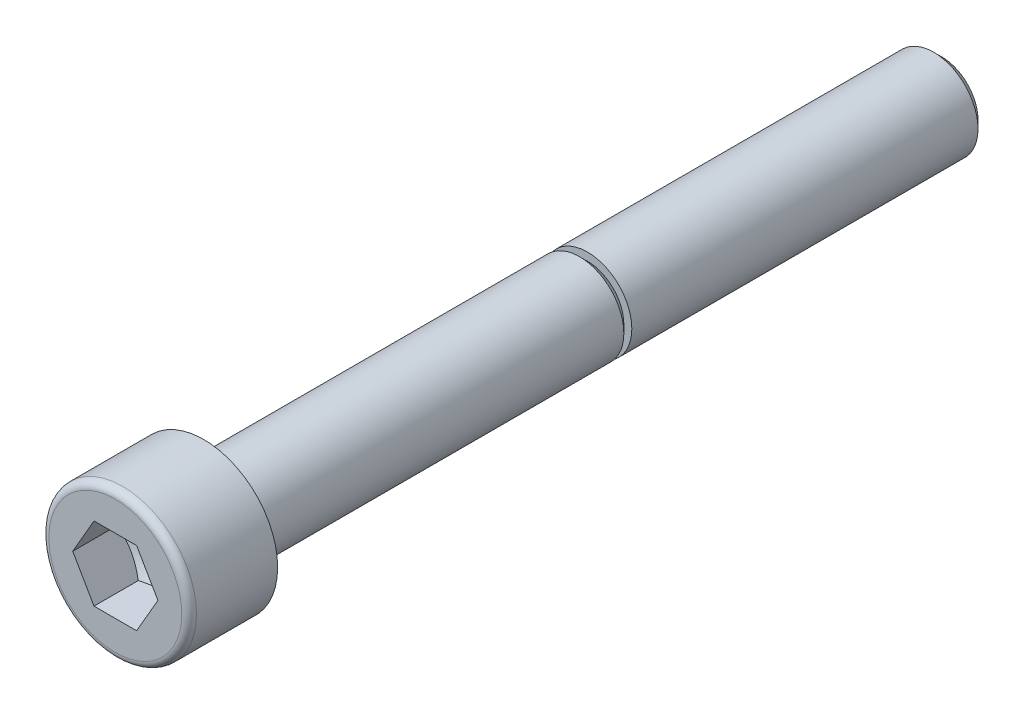
ISO-10303-21;
HEADER;
FILE_DESCRIPTION(('STEP AP214'),'2;1');
FILE_NAME('part.step','',(''),(''),'','','');
FILE_SCHEMA(('AUTOMOTIVE_DESIGN { 1 0 10303 214 1 1 1 1 }'));
ENDSEC;
DATA;
#1=APPLICATION_CONTEXT('core data for automotive mechanical design processes');
#2=APPLICATION_PROTOCOL_DEFINITION('international standard','automotive_design',2000,#1);
#3=PRODUCT_CONTEXT('',#1,'mechanical');
#4=PRODUCT('Part','Part','',(#3));
#5=PRODUCT_RELATED_PRODUCT_CATEGORY('part','',(#4));
#6=PRODUCT_DEFINITION_FORMATION('','',#4);
#7=PRODUCT_DEFINITION_CONTEXT('part definition',#1,'design');
#8=PRODUCT_DEFINITION('design','',#6,#7);
#9=PRODUCT_DEFINITION_SHAPE('','',#8);
#10=(LENGTH_UNIT() NAMED_UNIT(*) SI_UNIT(.MILLI.,.METRE.));
#11=(NAMED_UNIT(*) PLANE_ANGLE_UNIT() SI_UNIT($,.RADIAN.));
#12=(NAMED_UNIT(*) SI_UNIT($,.STERADIAN.) SOLID_ANGLE_UNIT());
#13=UNCERTAINTY_MEASURE_WITH_UNIT(LENGTH_MEASURE(1.E-05),#10,'distance_accuracy_value','');
#14=(GEOMETRIC_REPRESENTATION_CONTEXT(3) GLOBAL_UNCERTAINTY_ASSIGNED_CONTEXT((#13)) GLOBAL_UNIT_ASSIGNED_CONTEXT((#10,
#11,#12)) REPRESENTATION_CONTEXT('',''));
#15=CARTESIAN_POINT('',(0.,0.,0.));
#16=DIRECTION('',(0.,0.,1.));
#17=DIRECTION('',(1.,0.,0.));
#18=AXIS2_PLACEMENT_3D('',#15,#16,#17);
#19=CARTESIAN_POINT('',(0.,4.5,6.));
#20=DIRECTION('',(0.,0.,-1.));
#21=DIRECTION('',(-1.,0.,0.));
#22=AXIS2_PLACEMENT_3D('',#19,#20,#21);
#23=PLANE('',#22);
#24=CARTESIAN_POINT('',(0.,0.,6.));
#25=DIRECTION('',(0.,0.,1.));
#26=DIRECTION('',(1.,0.,0.));
#27=AXIS2_PLACEMENT_3D('',#24,#25,#26);
#28=CIRCLE('',#27,4.5);
#29=CARTESIAN_POINT('',(4.5,0.,6.));
#30=VERTEX_POINT('',#29);
#31=EDGE_CURVE('E136',#30,#30,#28,.T.);
#32=ORIENTED_EDGE('',*,*,#31,.T.);
#33=EDGE_LOOP('',(#32));
#34=FACE_BOUND('',#33,.T.);
#35=DIRECTION('',(0.5,-0.866025403784439,0.));
#36=VECTOR('',#35,1.);
#37=CARTESIAN_POINT('',(1.443375,2.49999883437473,6.));
#38=LINE('',#37,#36);
#39=CARTESIAN_POINT('',(1.443375,2.49999883437473,6.));
#40=VERTEX_POINT('',#39);
#41=CARTESIAN_POINT('',(2.88675,0.,6.));
#42=VERTEX_POINT('',#41);
#43=EDGE_CURVE('E30',#40,#42,#38,.T.);
#44=ORIENTED_EDGE('',*,*,#43,.T.);
#45=DIRECTION('',(-0.5,-0.866025403784439,0.));
#46=VECTOR('',#45,1.);
#47=CARTESIAN_POINT('',(2.88675,0.,6.));
#48=LINE('',#47,#46);
#49=CARTESIAN_POINT('',(1.443375,-2.49999883437473,6.));
#50=VERTEX_POINT('',#49);
#51=EDGE_CURVE('E183',#42,#50,#48,.T.);
#52=ORIENTED_EDGE('',*,*,#51,.T.);
#53=DIRECTION('',(-1.,0.,0.));
#54=VECTOR('',#53,1.);
#55=CARTESIAN_POINT('',(1.443375,-2.49999883437473,6.));
#56=LINE('',#55,#54);
#57=CARTESIAN_POINT('',(-1.443375,-2.49999883437473,6.));
#58=VERTEX_POINT('',#57);
#59=EDGE_CURVE('E188',#50,#58,#56,.T.);
#60=ORIENTED_EDGE('',*,*,#59,.T.);
#61=DIRECTION('',(-0.5,0.866025403784439,0.));
#62=VECTOR('',#61,1.);
#63=CARTESIAN_POINT('',(-1.443375,-2.49999883437473,6.));
#64=LINE('',#63,#62);
#65=CARTESIAN_POINT('',(-2.88675,0.,6.));
#66=VERTEX_POINT('',#65);
#67=EDGE_CURVE('E192',#58,#66,#64,.T.);
#68=ORIENTED_EDGE('',*,*,#67,.T.);
#69=DIRECTION('',(0.5,0.866025403784439,0.));
#70=VECTOR('',#69,1.);
#71=CARTESIAN_POINT('',(-2.88675,0.,6.));
#72=LINE('',#71,#70);
#73=CARTESIAN_POINT('',(-1.443375,2.49999883437473,6.));
#74=VERTEX_POINT('',#73);
#75=EDGE_CURVE('E102',#66,#74,#72,.T.);
#76=ORIENTED_EDGE('',*,*,#75,.T.);
#77=DIRECTION('',(1.,0.,0.));
#78=VECTOR('',#77,1.);
#79=CARTESIAN_POINT('',(-1.443375,2.49999883437473,6.));
#80=LINE('',#79,#78);
#81=EDGE_CURVE('E93',#74,#40,#80,.T.);
#82=ORIENTED_EDGE('',*,*,#81,.T.);
#83=EDGE_LOOP('',(#44,#52,#60,#68,#76,#82));
#84=FACE_BOUND('',#83,.T.);
#85=ADVANCED_FACE('F15',(#34,#84),#23,.F.);
#86=CARTESIAN_POINT('',(0.,0.,0.));
#87=DIRECTION('',(0.,0.,1.));
#88=DIRECTION('',(1.,0.,0.));
#89=AXIS2_PLACEMENT_3D('',#86,#87,#88);
#90=PLANE('',#89);
#91=CARTESIAN_POINT('',(0.,0.,0.));
#92=DIRECTION('',(0.,0.,1.));
#93=DIRECTION('',(1.,0.,0.));
#94=AXIS2_PLACEMENT_3D('',#91,#92,#93);
#95=CIRCLE('',#94,5.);
#96=CARTESIAN_POINT('',(5.,0.,0.));
#97=VERTEX_POINT('',#96);
#98=EDGE_CURVE('E23',#97,#97,#95,.T.);
#99=ORIENTED_EDGE('',*,*,#98,.F.);
#100=EDGE_LOOP('',(#99));
#101=FACE_BOUND('',#100,.T.);
#102=CARTESIAN_POINT('',(0.,0.,0.));
#103=DIRECTION('',(0.,0.,1.));
#104=DIRECTION('',(1.,0.,0.));
#105=AXIS2_PLACEMENT_3D('',#102,#103,#104);
#106=CIRCLE('',#105,3.);
#107=CARTESIAN_POINT('',(3.,0.,0.));
#108=VERTEX_POINT('',#107);
#109=EDGE_CURVE('E9',#108,#108,#106,.F.);
#110=ORIENTED_EDGE('',*,*,#109,.F.);
#111=EDGE_LOOP('',(#110));
#112=FACE_BOUND('',#111,.T.);
#113=ADVANCED_FACE('F151',(#101,#112),#90,.F.);
#114=CARTESIAN_POINT('',(0.,0.,6.));
#115=DIRECTION('',(0.,0.,1.));
#116=DIRECTION('',(1.,0.,0.));
#117=AXIS2_PLACEMENT_3D('',#114,#115,#116);
#118=CYLINDRICAL_SURFACE('',#117,5.);
#119=CARTESIAN_POINT('',(0.,0.,5.5));
#120=DIRECTION('',(0.,0.,1.));
#121=DIRECTION('',(1.,0.,0.));
#122=AXIS2_PLACEMENT_3D('',#119,#120,#121);
#123=CIRCLE('',#122,5.);
#124=CARTESIAN_POINT('',(5.,0.,5.5));
#125=VERTEX_POINT('',#124);
#126=EDGE_CURVE('E140',#125,#125,#123,.T.);
#127=ORIENTED_EDGE('',*,*,#126,.F.);
#128=EDGE_LOOP('',(#127));
#129=FACE_BOUND('',#128,.T.);
#130=ORIENTED_EDGE('',*,*,#98,.T.);
#131=EDGE_LOOP('',(#130));
#132=FACE_BOUND('',#131,.T.);
#133=ADVANCED_FACE('F149',(#129,#132),#118,.T.);
#134=CARTESIAN_POINT('',(0.,0.,5.5));
#135=DIRECTION('',(0.,0.,1.));
#136=DIRECTION('',(1.,0.,0.));
#137=AXIS2_PLACEMENT_3D('',#134,#135,#136);
#138=TOROIDAL_SURFACE('',#137,4.5,0.5);
#139=ORIENTED_EDGE('',*,*,#31,.F.);
#140=EDGE_LOOP('',(#139));
#141=FACE_BOUND('',#140,.T.);
#142=ORIENTED_EDGE('',*,*,#126,.T.);
#143=EDGE_LOOP('',(#142));
#144=FACE_BOUND('',#143,.T.);
#145=ADVANCED_FACE('F159',(#141,#144),#138,.T.);
#146=CARTESIAN_POINT('',(0.,0.,0.));
#147=DIRECTION('',(0.,0.,1.));
#148=DIRECTION('',(1.,0.,0.));
#149=AXIS2_PLACEMENT_3D('',#146,#147,#148);
#150=CYLINDRICAL_SURFACE('',#149,3.);
#151=CARTESIAN_POINT('',(0.,0.,-25.45875));
#152=DIRECTION('',(0.,0.,1.));
#153=DIRECTION('',(1.,0.,0.));
#154=AXIS2_PLACEMENT_3D('',#151,#152,#153);
#155=CIRCLE('',#154,3.);
#156=CARTESIAN_POINT('',(3.,0.,-25.45875));
#157=VERTEX_POINT('',#156);
#158=EDGE_CURVE('E116',#157,#157,#155,.T.);
#159=ORIENTED_EDGE('',*,*,#158,.T.);
#160=EDGE_LOOP('',(#159));
#161=FACE_BOUND('',#160,.T.);
#162=ORIENTED_EDGE('',*,*,#109,.T.);
#163=EDGE_LOOP('',(#162));
#164=FACE_BOUND('',#163,.T.);
#165=ADVANCED_FACE('F156',(#161,#164),#150,.T.);
#166=CARTESIAN_POINT('',(0.,0.,-50.));
#167=DIRECTION('',(0.,0.,1.));
#168=DIRECTION('',(1.,0.,0.));
#169=AXIS2_PLACEMENT_3D('',#166,#167,#168);
#170=PLANE('',#169);
#171=CARTESIAN_POINT('',(0.,0.,-50.));
#172=DIRECTION('',(0.,0.,1.));
#173=DIRECTION('',(1.,0.,0.));
#174=AXIS2_PLACEMENT_3D('',#171,#172,#173);
#175=CIRCLE('',#174,2.45875);
#176=CARTESIAN_POINT('',(2.45875,0.,-50.));
#177=VERTEX_POINT('',#176);
#178=EDGE_CURVE('E132',#177,#177,#175,.T.);
#179=ORIENTED_EDGE('',*,*,#178,.F.);
#180=EDGE_LOOP('',(#179));
#181=FACE_BOUND('',#180,.T.);
#182=ADVANCED_FACE('F158',(#181),#170,.F.);
#183=CARTESIAN_POINT('',(0.,0.,-50.));
#184=DIRECTION('',(0.,0.,1.));
#185=DIRECTION('',(1.,0.,0.));
#186=AXIS2_PLACEMENT_3D('',#183,#184,#185);
#187=CONICAL_SURFACE('',#186,2.45875,0.785398163397457);
#188=CARTESIAN_POINT('',(0.,0.,-49.45875));
#189=DIRECTION('',(0.,0.,1.));
#190=DIRECTION('',(1.,0.,0.));
#191=AXIS2_PLACEMENT_3D('',#188,#189,#190);
#192=CIRCLE('',#191,3.);
#193=CARTESIAN_POINT('',(3.,0.,-49.45875));
#194=VERTEX_POINT('',#193);
#195=EDGE_CURVE('E128',#194,#194,#192,.T.);
#196=ORIENTED_EDGE('',*,*,#195,.F.);
#197=EDGE_LOOP('',(#196));
#198=FACE_BOUND('',#197,.T.);
#199=ORIENTED_EDGE('',*,*,#178,.T.);
#200=EDGE_LOOP('',(#199));
#201=FACE_BOUND('',#200,.T.);
#202=ADVANCED_FACE('F167',(#198,#201),#187,.T.);
#203=CARTESIAN_POINT('',(0.,0.,0.));
#204=DIRECTION('',(0.,0.,1.));
#205=DIRECTION('',(1.,0.,0.));
#206=AXIS2_PLACEMENT_3D('',#203,#204,#205);
#207=CYLINDRICAL_SURFACE('',#206,3.);
#208=CARTESIAN_POINT('',(0.,0.,-26.));
#209=DIRECTION('',(0.,0.,1.));
#210=DIRECTION('',(1.,0.,0.));
#211=AXIS2_PLACEMENT_3D('',#208,#209,#210);
#212=CIRCLE('',#211,3.);
#213=CARTESIAN_POINT('',(3.,0.,-26.));
#214=VERTEX_POINT('',#213);
#215=EDGE_CURVE('E124',#214,#214,#212,.T.);
#216=ORIENTED_EDGE('',*,*,#215,.F.);
#217=EDGE_LOOP('',(#216));
#218=FACE_BOUND('',#217,.T.);
#219=ORIENTED_EDGE('',*,*,#195,.T.);
#220=EDGE_LOOP('',(#219));
#221=FACE_BOUND('',#220,.T.);
#222=ADVANCED_FACE('F328',(#218,#221),#207,.T.);
#223=CARTESIAN_POINT('',(0.,3.,-26.));
#224=DIRECTION('',(0.,0.,-1.));
#225=DIRECTION('',(-1.,0.,0.));
#226=AXIS2_PLACEMENT_3D('',#223,#224,#225);
#227=PLANE('',#226);
#228=CARTESIAN_POINT('',(0.,0.,-26.));
#229=DIRECTION('',(0.,0.,1.));
#230=DIRECTION('',(1.,0.,0.));
#231=AXIS2_PLACEMENT_3D('',#228,#229,#230);
#232=CIRCLE('',#231,2.45875);
#233=CARTESIAN_POINT('',(2.45875,0.,-26.));
#234=VERTEX_POINT('',#233);
#235=EDGE_CURVE('E120',#234,#234,#232,.T.);
#236=ORIENTED_EDGE('',*,*,#235,.F.);
#237=EDGE_LOOP('',(#236));
#238=FACE_BOUND('',#237,.T.);
#239=ORIENTED_EDGE('',*,*,#215,.T.);
#240=EDGE_LOOP('',(#239));
#241=FACE_BOUND('',#240,.T.);
#242=ADVANCED_FACE('F320',(#238,#241),#227,.F.);
#243=CARTESIAN_POINT('',(0.,0.,-26.));
#244=DIRECTION('',(0.,0.,1.));
#245=DIRECTION('',(1.,0.,0.));
#246=AXIS2_PLACEMENT_3D('',#243,#244,#245);
#247=CONICAL_SURFACE('',#246,2.45875,0.785398163397453);
#248=ORIENTED_EDGE('',*,*,#158,.F.);
#249=EDGE_LOOP('',(#248));
#250=FACE_BOUND('',#249,.T.);
#251=ORIENTED_EDGE('',*,*,#235,.T.);
#252=EDGE_LOOP('',(#251));
#253=FACE_BOUND('',#252,.T.);
#254=ADVANCED_FACE('F313',(#250,#253),#247,.T.);
#255=CARTESIAN_POINT('',(1.443375,2.49999883437473,1.33333411041685));
#256=DIRECTION('',(-0.866025403784439,-0.5,0.));
#257=DIRECTION('',(-0.5,0.866025403784438,0.));
#258=AXIS2_PLACEMENT_3D('',#255,#256,#257);
#259=PLANE('',#258);
#260=DIRECTION('',(0.,0.,1.));
#261=VECTOR('',#260,1.);
#262=CARTESIAN_POINT('',(2.88675,0.,1.33333411041685));
#263=LINE('',#262,#261);
#264=CARTESIAN_POINT('',(2.88675,0.,3.));
#265=VERTEX_POINT('',#264);
#266=EDGE_CURVE('E114',#265,#42,#263,.T.);
#267=ORIENTED_EDGE('',*,*,#266,.T.);
#268=ORIENTED_EDGE('',*,*,#43,.F.);
#269=DIRECTION('',(0.,0.,1.));
#270=VECTOR('',#269,1.);
#271=CARTESIAN_POINT('',(1.443375,2.49999883437473,1.33333411041685));
#272=LINE('',#271,#270);
#273=CARTESIAN_POINT('',(1.443375,2.49999883437473,3.));
#274=VERTEX_POINT('',#273);
#275=EDGE_CURVE('E86',#274,#40,#272,.T.);
#276=ORIENTED_EDGE('',*,*,#275,.F.);
#277=CARTESIAN_POINT('',(2.88675115470054,-2.E-06,3.00000066666707));
#278=CARTESIAN_POINT('',(2.82332354535897,0.109857841982227,2.96337006039726));
#279=CARTESIAN_POINT('',(2.75934842983882,0.220665992483223,2.93005643273496));
#280=CARTESIAN_POINT('',(2.63029051087885,0.444200865240994,2.87190847700775));
#281=CARTESIAN_POINT('',(2.56520541506427,0.556931558007335,2.84709471727335));
#282=CARTESIAN_POINT('',(2.4358417909861,0.78099592756197,2.8084702850323));
#283=CARTESIAN_POINT('',(2.37158316147789,0.892295138694932,2.79440251599447));
#284=CARTESIAN_POINT('',(2.24276369983448,1.11541699126498,2.77761163079658));
#285=CARTESIAN_POINT('',(2.17820333560637,1.22723882226323,2.77487460704407));
#286=CARTESIAN_POINT('',(2.05757906871724,1.43616618114094,2.7805828840092));
#287=CARTESIAN_POINT('',(2.00149706603362,1.53330305917919,2.78762661346734));
#288=CARTESIAN_POINT('',(1.88969841687931,1.72694399973201,2.8099466525033));
#289=CARTESIAN_POINT('',(1.83398215680598,1.82344739298676,2.82523057920943));
#290=CARTESIAN_POINT('',(1.72195318911858,2.01748725694082,2.86343746342627));
#291=CARTESIAN_POINT('',(1.66565465323697,2.1149991814795,2.88652230296935));
#292=CARTESIAN_POINT('',(1.55389703460282,2.30856905508676,2.93891513912548));
#293=CARTESIAN_POINT('',(1.49843652119396,2.40462948212476,2.96821083329068));
#294=CARTESIAN_POINT('',(1.44337384529946,2.50000083437473,3.00000066666707));
#295=B_SPLINE_CURVE_WITH_KNOTS('',3,(#277,#278,#279,#280,#281,#282,#283,#284,#285,#286,#287,
#288,#289,#290,#291,#292,#293,#294),.UNSPECIFIED.,.F.,.F.,(4,2,2,2,2,2,2,2,4),(0.,
0.396269987805477,0.793492221888839,1.1808844206854,1.56780098500208,1.90463546712439,
2.24178184973835,2.58640455505215,2.93035090593904),.UNSPECIFIED.);
#296=EDGE_CURVE('E78',#265,#274,#295,.T.);
#297=ORIENTED_EDGE('',*,*,#296,.F.);
#298=EDGE_LOOP('',(#267,#268,#276,#297));
#299=FACE_BOUND('',#298,.T.);
#300=ADVANCED_FACE('F87',(#299),#259,.T.);
#301=CARTESIAN_POINT('',(2.88675,0.,1.33333411041685));
#302=DIRECTION('',(-0.866025403784439,0.5,0.));
#303=DIRECTION('',(0.5,0.866025403784439,0.));
#304=AXIS2_PLACEMENT_3D('',#301,#302,#303);
#305=PLANE('',#304);
#306=DIRECTION('',(0.,0.,1.));
#307=VECTOR('',#306,1.);
#308=CARTESIAN_POINT('',(1.443375,-2.49999883437473,1.33333411041685));
#309=LINE('',#308,#307);
#310=CARTESIAN_POINT('',(1.443375,-2.49999883437473,3.));
#311=VERTEX_POINT('',#310);
#312=EDGE_CURVE('E111',#311,#50,#309,.T.);
#313=ORIENTED_EDGE('',*,*,#312,.T.);
#314=ORIENTED_EDGE('',*,*,#51,.F.);
#315=ORIENTED_EDGE('',*,*,#266,.F.);
#316=CARTESIAN_POINT('',(1.44337384529946,-2.50000083437473,3.00000066666707));
#317=CARTESIAN_POINT('',(1.50680145464103,-2.3901409923925,2.96337006039726));
#318=CARTESIAN_POINT('',(1.57077657016118,-2.27933284189151,2.93005643273496));
#319=CARTESIAN_POINT('',(1.69983448912115,-2.05579796913373,2.87190847700775));
#320=CARTESIAN_POINT('',(1.76491958493573,-1.94306727636739,2.84709471727335));
#321=CARTESIAN_POINT('',(1.8942832090139,-1.71900290681276,2.8084702850323));
#322=CARTESIAN_POINT('',(1.95854183852211,-1.6077036956798,2.79440251599447));
#323=CARTESIAN_POINT('',(2.08736130016552,-1.38458184310974,2.77761163079658));
#324=CARTESIAN_POINT('',(2.15192166439363,-1.2727600121115,2.77487460704408));
#325=CARTESIAN_POINT('',(2.27254593128276,-1.06383265323379,2.7805828840092));
#326=CARTESIAN_POINT('',(2.32862793396638,-0.966695775195541,2.78762661346734));
#327=CARTESIAN_POINT('',(2.44042658312069,-0.773054834642715,2.8099466525033));
#328=CARTESIAN_POINT('',(2.49614284319403,-0.676551441387972,2.82523057920943));
#329=CARTESIAN_POINT('',(2.60817181088142,-0.482511577433911,2.86343746342627));
#330=CARTESIAN_POINT('',(2.66447034676303,-0.384999652895224,2.88652230296935));
#331=CARTESIAN_POINT('',(2.77622796539718,-0.191429779287974,2.93891513912548));
#332=CARTESIAN_POINT('',(2.83168847880604,-0.0953693522499732,2.96821083329068));
#333=CARTESIAN_POINT('',(2.88675115470054,2.00000000025213E-06,3.00000066666707));
#334=B_SPLINE_CURVE_WITH_KNOTS('',3,(#316,#317,#318,#319,#320,#321,#322,#323,#324,#325,#326,
#327,#328,#329,#330,#331,#332,#333),.UNSPECIFIED.,.F.,.F.,(4,2,2,2,2,2,2,2,4),(0.,
0.396269987805478,0.79349222188884,1.1808844206854,1.56780098500208,1.90463546712439,
2.24178184973836,2.58640455505215,2.93035090593904),.UNSPECIFIED.);
#335=EDGE_CURVE('E82',#311,#265,#334,.T.);
#336=ORIENTED_EDGE('',*,*,#335,.F.);
#337=EDGE_LOOP('',(#313,#314,#315,#336));
#338=FACE_BOUND('',#337,.T.);
#339=ADVANCED_FACE('F248',(#338),#305,.T.);
#340=CARTESIAN_POINT('',(1.443375,-2.49999883437473,1.33333411041685));
#341=DIRECTION('',(0.,1.,0.));
#342=DIRECTION('',(1.,0.,0.));
#343=AXIS2_PLACEMENT_3D('',#340,#341,#342);
#344=PLANE('',#343);
#345=DIRECTION('',(0.,0.,1.));
#346=VECTOR('',#345,1.);
#347=CARTESIAN_POINT('',(-1.443375,-2.49999883437473,1.33333411041685));
#348=LINE('',#347,#346);
#349=CARTESIAN_POINT('',(-1.443375,-2.49999883437473,3.));
#350=VERTEX_POINT('',#349);
#351=EDGE_CURVE('E108',#350,#58,#348,.T.);
#352=ORIENTED_EDGE('',*,*,#351,.T.);
#353=ORIENTED_EDGE('',*,*,#59,.F.);
#354=ORIENTED_EDGE('',*,*,#312,.F.);
#355=CARTESIAN_POINT('',(-3.73786106214979,-2.49999883437473,3.92958778907324));
#356=CARTESIAN_POINT('',(-3.62990250335969,-2.49999883437473,3.87779335774325));
#357=CARTESIAN_POINT('',(-3.52168094276801,-2.49999883437473,3.82653690477121));
#358=CARTESIAN_POINT('',(-3.30457164494513,-2.49999883437473,3.72540514162743));
#359=CARTESIAN_POINT('',(-3.19568379207403,-2.49999883437473,3.67553008001432));
#360=CARTESIAN_POINT('',(-2.9764774054262,-2.49999883437473,3.57718765766728));
#361=CARTESIAN_POINT('',(-2.86615419981139,-2.49999883437473,3.52873067133896));
#362=CARTESIAN_POINT('',(-2.64458202847932,-2.49999883437473,3.4339896311619));
#363=CARTESIAN_POINT('',(-2.53333311125245,-2.49999883437473,3.38770546433014));
#364=CARTESIAN_POINT('',(-2.30680205819545,-2.49999883437473,3.2967100755852));
#365=CARTESIAN_POINT('',(-2.19149052050016,-2.49999883437473,3.2520716190807));
#366=CARTESIAN_POINT('',(-1.95947266398433,-2.49999883437473,3.1665059843482));
#367=CARTESIAN_POINT('',(-1.84276618516189,-2.49999883437473,3.12557923657333));
#368=CARTESIAN_POINT('',(-1.60804233924781,-2.49999883437473,3.04860739009266));
#369=CARTESIAN_POINT('',(-1.49002871456052,-2.49999883437473,3.01255100191558));
#370=CARTESIAN_POINT('',(-1.25231014409633,-2.49999883437473,2.94655294839667));
#371=CARTESIAN_POINT('',(-1.13260562628878,-2.49999883437473,2.91660976441946));
#372=CARTESIAN_POINT('',(-0.891754624847682,-2.49999883437473,2.86443431611274));
#373=CARTESIAN_POINT('',(-0.770611640017906,-2.49999883437473,2.84218621451804));
#374=CARTESIAN_POINT('',(-0.526970339246118,-2.49999883437473,2.8068577746921));
#375=CARTESIAN_POINT('',(-0.404472115461951,-2.49999883437473,2.79377681692952));
#376=CARTESIAN_POINT('',(-0.160266323051493,-2.49999883437473,2.7779963214066));
#377=CARTESIAN_POINT('',(-0.0385668667227562,-2.49999883437473,2.77517427588141));
#378=CARTESIAN_POINT('',(0.204641816788917,-2.49999883437473,2.77983589012324));
#379=CARTESIAN_POINT('',(0.326151031726512,-2.49999883437473,2.78732018801759));
#380=CARTESIAN_POINT('',(0.536550258909014,-2.49999883437473,2.80869871352845));
#381=CARTESIAN_POINT('',(0.62567290534766,-2.49999883437473,2.82040889034712));
#382=CARTESIAN_POINT('',(0.80317291802574,-2.49999883437473,2.84856827951529));
#383=CARTESIAN_POINT('',(0.89155015258231,-2.49999883437473,2.86501831186796));
#384=CARTESIAN_POINT('',(1.15551819105506,-2.49999883437473,2.920608175745));
#385=CARTESIAN_POINT('',(1.32980784141715,-2.49999883437473,2.96597208143992));
#386=CARTESIAN_POINT('',(1.59042319619559,-2.49999883437473,3.04347409361569));
#387=CARTESIAN_POINT('',(1.6781227038712,-2.49999883437473,3.07124565241289));
#388=CARTESIAN_POINT('',(1.85261386594625,-2.49999883437473,3.12935698644029));
#389=CARTESIAN_POINT('',(1.93940604944137,-2.49999883437473,3.15969515890171));
#390=CARTESIAN_POINT('',(2.11219208096506,-2.49999883437473,3.2225001255257));
#391=CARTESIAN_POINT('',(2.19818607085344,-2.49999883437473,3.25496653284332));
#392=CARTESIAN_POINT('',(2.36949689943691,-2.49999883437473,3.32167630023758));
#393=CARTESIAN_POINT('',(2.4548136208992,-2.49999883437473,3.35591996053755));
#394=CARTESIAN_POINT('',(2.6725866434786,-2.49999883437473,3.44552247380957));
#395=CARTESIAN_POINT('',(2.80460719164756,-2.49999883437473,3.50193903020824));
#396=CARTESIAN_POINT('',(3.06745887456859,-2.49999883437473,3.61748626069377));
#397=CARTESIAN_POINT('',(3.19828991933625,-2.49999883437473,3.6766171381022));
#398=CARTESIAN_POINT('',(3.4590085358823,-2.49999883437473,3.79697662160321));
#399=CARTESIAN_POINT('',(3.58889593921384,-2.49999883437473,3.85820559158554));
#400=CARTESIAN_POINT('',(3.84788850349047,-2.49999883437473,3.98229871528446));
#401=CARTESIAN_POINT('',(3.97699364696087,-2.49999883437473,4.04516290536492));
#402=CARTESIAN_POINT('',(4.36366797006391,-2.49999883437473,4.23583166126771));
#403=CARTESIAN_POINT('',(4.62028446759073,-2.49999883437473,4.36556642178983));
#404=CARTESIAN_POINT('',(5.13176042686128,-2.49999883437473,4.62835386929467));
#405=CARTESIAN_POINT('',(5.38662010673858,-2.49999883437473,4.76140613453321));
#406=CARTESIAN_POINT('',(5.87112459117811,-2.49999883437473,5.01714634418064));
#407=CARTESIAN_POINT('',(6.10087887005075,-2.49999883437473,5.13962722061171));
#408=CARTESIAN_POINT('',(6.55964844430519,-2.49999883437473,5.38598343470431));
#409=CARTESIAN_POINT('',(6.78866371193351,-2.49999883437473,5.50985882397014));
#410=CARTESIAN_POINT('',(7.2455430452267,-2.49999883437473,5.75833902928913));
#411=CARTESIAN_POINT('',(7.47340855738404,-2.49999883437473,5.88294118863516));
#412=CARTESIAN_POINT('',(7.9286788902648,-2.49999883437473,6.13295649095833));
#413=CARTESIAN_POINT('',(8.156083734473,-2.49999883437473,6.25836959115399));
#414=CARTESIAN_POINT('',(8.38332307978598,-2.49999883437473,6.38407993098458));
#415=B_SPLINE_CURVE_WITH_KNOTS('',3,(#355,#356,#357,#358,#359,#360,#361,#362,#363,#364,#365,
#366,#367,#368,#369,#370,#371,#372,#373,#374,#375,#376,#377,#378,#379,#380,#381,#382,#383,#384,
#385,#386,#387,#388,#389,#390,#391,#392,#393,#394,#395,#396,#397,#398,#399,#400,#401,#402,#403,
#404,#405,#406,#407,#408,#409,#410,#411,#412,#413,#414),.UNSPECIFIED.,.F.,.F.,(4,2,2,2,2,2,2,2,
2,2,2,2,2,2,2,2,2,2,2,2,2,2,2,2,2,2,2,2,2,4),(0.,0.359225681612437,0.718515585501186,
1.07998495471943,1.44143550726446,1.81233642992121,2.18328031172541,2.553349025072,
2.92332569419794,3.29253631826214,3.66172198803058,4.02648423639168,4.39126907037958,
4.66080188357842,4.93038135444365,5.4699536049164,5.74590907322745,6.02169347043866,
6.29742787713709,6.57320901498075,7.00387400010299,7.43457129784687,7.86534367692857,
8.29612564369277,9.15872160396268,10.0212084586034,10.8022892260896,11.5833989933082,
12.3625220011586,13.1416042361018),.UNSPECIFIED.);
#416=EDGE_CURVE('E236',#350,#311,#415,.T.);
#417=ORIENTED_EDGE('',*,*,#416,.F.);
#418=EDGE_LOOP('',(#352,#353,#354,#417));
#419=FACE_BOUND('',#418,.T.);
#420=ADVANCED_FACE('F243',(#419),#344,.T.);
#421=CARTESIAN_POINT('',(-1.443375,-2.49999883437473,1.33333411041685));
#422=DIRECTION('',(0.866025403784439,0.5,0.));
#423=DIRECTION('',(0.5,-0.866025403784439,0.));
#424=AXIS2_PLACEMENT_3D('',#421,#422,#423);
#425=PLANE('',#424);
#426=DIRECTION('',(0.,0.,1.));
#427=VECTOR('',#426,1.);
#428=CARTESIAN_POINT('',(-2.88675,0.,1.33333411041685));
#429=LINE('',#428,#427);
#430=CARTESIAN_POINT('',(-2.88675,0.,3.));
#431=VERTEX_POINT('',#430);
#432=EDGE_CURVE('E99',#431,#66,#429,.T.);
#433=ORIENTED_EDGE('',*,*,#432,.T.);
#434=ORIENTED_EDGE('',*,*,#67,.F.);
#435=ORIENTED_EDGE('',*,*,#351,.F.);
#436=CARTESIAN_POINT('',(-2.88675115470054,2.00000000083267E-06,3.00000066666707));
#437=CARTESIAN_POINT('',(-2.82332354535897,-0.109857841982226,2.96337006039727));
#438=CARTESIAN_POINT('',(-2.75934842983882,-0.220665992483222,2.93005643273496));
#439=CARTESIAN_POINT('',(-2.63029051087885,-0.444200865240993,2.87190847700775));
#440=CARTESIAN_POINT('',(-2.56520541506427,-0.556931558007334,2.84709471727335));
#441=CARTESIAN_POINT('',(-2.4358417909861,-0.780995927561968,2.8084702850323));
#442=CARTESIAN_POINT('',(-2.37158316147789,-0.89229513869493,2.79440251599447));
#443=CARTESIAN_POINT('',(-2.24276369983448,-1.11541699126498,2.77761163079658));
#444=CARTESIAN_POINT('',(-2.17820333560637,-1.22723882226323,2.77487460704408));
#445=CARTESIAN_POINT('',(-2.05757906871724,-1.43616618114094,2.7805828840092));
#446=CARTESIAN_POINT('',(-2.00149706603362,-1.53330305917919,2.78762661346734));
#447=CARTESIAN_POINT('',(-1.88969841687931,-1.72694399973201,2.8099466525033));
#448=CARTESIAN_POINT('',(-1.83398215680598,-1.82344739298676,2.82523057920943));
#449=CARTESIAN_POINT('',(-1.72195318911858,-2.01748725694082,2.86343746342627));
#450=CARTESIAN_POINT('',(-1.66565465323697,-2.1149991814795,2.88652230296935));
#451=CARTESIAN_POINT('',(-1.55389703460282,-2.30856905508676,2.93891513912548));
#452=CARTESIAN_POINT('',(-1.49843652119396,-2.40462948212476,2.96821083329068));
#453=CARTESIAN_POINT('',(-1.44337384529946,-2.50000083437473,3.00000066666707));
#454=B_SPLINE_CURVE_WITH_KNOTS('',3,(#436,#437,#438,#439,#440,#441,#442,#443,#444,#445,#446,
#447,#448,#449,#450,#451,#452,#453),.UNSPECIFIED.,.F.,.F.,(4,2,2,2,2,2,2,2,4),(0.,
0.396269987805478,0.793492221888839,1.1808844206854,1.56780098500208,1.90463546712439,
2.24178184973836,2.58640455505215,2.93035090593905),.UNSPECIFIED.);
#455=EDGE_CURVE('E229',#431,#350,#454,.T.);
#456=ORIENTED_EDGE('',*,*,#455,.F.);
#457=EDGE_LOOP('',(#433,#434,#435,#456));
#458=FACE_BOUND('',#457,.T.);
#459=ADVANCED_FACE('F212',(#458),#425,.T.);
#460=CARTESIAN_POINT('',(-2.88675,0.,1.33333411041685));
#461=DIRECTION('',(0.866025403784439,-0.5,0.));
#462=DIRECTION('',(-0.5,-0.866025403784439,0.));
#463=AXIS2_PLACEMENT_3D('',#460,#461,#462);
#464=PLANE('',#463);
#465=DIRECTION('',(0.,0.,1.));
#466=VECTOR('',#465,1.);
#467=CARTESIAN_POINT('',(-1.443375,2.49999883437473,1.33333411041685));
#468=LINE('',#467,#466);
#469=CARTESIAN_POINT('',(-1.443375,2.49999883437473,3.));
#470=VERTEX_POINT('',#469);
#471=EDGE_CURVE('E92',#470,#74,#468,.T.);
#472=ORIENTED_EDGE('',*,*,#471,.T.);
#473=ORIENTED_EDGE('',*,*,#75,.F.);
#474=ORIENTED_EDGE('',*,*,#432,.F.);
#475=CARTESIAN_POINT('',(-1.44337384529946,2.50000083437473,3.00000066666707));
#476=CARTESIAN_POINT('',(-1.50680145464103,2.3901409923925,2.96337006039726));
#477=CARTESIAN_POINT('',(-1.57077657016118,2.27933284189151,2.93005643273496));
#478=CARTESIAN_POINT('',(-1.69983448912115,2.05579796913373,2.87190847700775));
#479=CARTESIAN_POINT('',(-1.76491958493573,1.94306727636739,2.84709471727335));
#480=CARTESIAN_POINT('',(-1.8942832090139,1.71900290681276,2.8084702850323));
#481=CARTESIAN_POINT('',(-1.95854183852211,1.6077036956798,2.79440251599447));
#482=CARTESIAN_POINT('',(-2.08736130016552,1.38458184310974,2.77761163079658));
#483=CARTESIAN_POINT('',(-2.15192166439363,1.2727600121115,2.77487460704408));
#484=CARTESIAN_POINT('',(-2.27254593128276,1.06383265323379,2.7805828840092));
#485=CARTESIAN_POINT('',(-2.32862793396638,0.966695775195541,2.78762661346734));
#486=CARTESIAN_POINT('',(-2.44042658312069,0.773054834642715,2.8099466525033));
#487=CARTESIAN_POINT('',(-2.49614284319402,0.676551441387972,2.82523057920943));
#488=CARTESIAN_POINT('',(-2.60817181088142,0.482511577433911,2.86343746342627));
#489=CARTESIAN_POINT('',(-2.66447034676303,0.384999652895224,2.88652230296935));
#490=CARTESIAN_POINT('',(-2.77622796539718,0.191429779287974,2.93891513912548));
#491=CARTESIAN_POINT('',(-2.83168847880604,0.0953693522499737,2.96821083329068));
#492=CARTESIAN_POINT('',(-2.88675115470054,-1.9999999995853E-06,3.00000066666707));
#493=B_SPLINE_CURVE_WITH_KNOTS('',3,(#475,#476,#477,#478,#479,#480,#481,#482,#483,#484,#485,
#486,#487,#488,#489,#490,#491,#492),.UNSPECIFIED.,.F.,.F.,(4,2,2,2,2,2,2,2,4),(0.,
0.396269987805478,0.79349222188884,1.1808844206854,1.56780098500208,1.90463546712439,
2.24178184973835,2.58640455505215,2.93035090593904),.UNSPECIFIED.);
#494=EDGE_CURVE('E38',#470,#431,#493,.T.);
#495=ORIENTED_EDGE('',*,*,#494,.F.);
#496=EDGE_LOOP('',(#472,#473,#474,#495));
#497=FACE_BOUND('',#496,.T.);
#498=ADVANCED_FACE('F206',(#497),#464,.T.);
#499=CARTESIAN_POINT('',(-1.443375,2.49999883437473,1.33333411041685));
#500=DIRECTION('',(0.,-1.,0.));
#501=DIRECTION('',(-1.,0.,0.));
#502=AXIS2_PLACEMENT_3D('',#499,#500,#501);
#503=PLANE('',#502);
#504=ORIENTED_EDGE('',*,*,#275,.T.);
#505=ORIENTED_EDGE('',*,*,#81,.F.);
#506=ORIENTED_EDGE('',*,*,#471,.F.);
#507=CARTESIAN_POINT('',(-3.73786106214979,2.49999883437473,3.92958778907324));
#508=CARTESIAN_POINT('',(-3.62990250335969,2.49999883437473,3.87779335774325));
#509=CARTESIAN_POINT('',(-3.52168094276801,2.49999883437473,3.82653690477121));
#510=CARTESIAN_POINT('',(-3.30457164494513,2.49999883437473,3.72540514162743));
#511=CARTESIAN_POINT('',(-3.19568379207404,2.49999883437473,3.67553008001432));
#512=CARTESIAN_POINT('',(-2.9764774054262,2.49999883437473,3.57718765766728));
#513=CARTESIAN_POINT('',(-2.86615419981139,2.49999883437473,3.52873067133896));
#514=CARTESIAN_POINT('',(-2.64458202847932,2.49999883437473,3.4339896311619));
#515=CARTESIAN_POINT('',(-2.53333311125245,2.49999883437473,3.38770546433014));
#516=CARTESIAN_POINT('',(-2.30680205819545,2.49999883437473,3.2967100755852));
#517=CARTESIAN_POINT('',(-2.19149052050016,2.49999883437473,3.2520716190807));
#518=CARTESIAN_POINT('',(-1.95947266398433,2.49999883437473,3.1665059843482));
#519=CARTESIAN_POINT('',(-1.8427661851619,2.49999883437473,3.12557923657333));
#520=CARTESIAN_POINT('',(-1.60804233924781,2.49999883437473,3.04860739009266));
#521=CARTESIAN_POINT('',(-1.49002871456052,2.49999883437473,3.01255100191558));
#522=CARTESIAN_POINT('',(-1.25231014409633,2.49999883437473,2.94655294839667));
#523=CARTESIAN_POINT('',(-1.13260562628879,2.49999883437473,2.91660976441946));
#524=CARTESIAN_POINT('',(-0.891754624847686,2.49999883437473,2.86443431611274));
#525=CARTESIAN_POINT('',(-0.770611640017909,2.49999883437473,2.84218621451804));
#526=CARTESIAN_POINT('',(-0.526970339246121,2.49999883437473,2.8068577746921));
#527=CARTESIAN_POINT('',(-0.404472115461954,2.49999883437473,2.79377681692952));
#528=CARTESIAN_POINT('',(-0.160266323051496,2.49999883437473,2.7779963214066));
#529=CARTESIAN_POINT('',(-0.0385668667227587,2.49999883437473,2.77517427588141));
#530=CARTESIAN_POINT('',(0.204641816788915,2.49999883437473,2.77983589012324));
#531=CARTESIAN_POINT('',(0.326151031726511,2.49999883437473,2.78732018801759));
#532=CARTESIAN_POINT('',(0.536550258909011,2.49999883437473,2.80869871352845));
#533=CARTESIAN_POINT('',(0.625672905347658,2.49999883437473,2.82040889034712));
#534=CARTESIAN_POINT('',(0.803172918025738,2.49999883437473,2.84856827951529));
#535=CARTESIAN_POINT('',(0.891550152582308,2.49999883437473,2.86501831186796));
#536=CARTESIAN_POINT('',(1.15551819105505,2.49999883437473,2.920608175745));
#537=CARTESIAN_POINT('',(1.32980784141715,2.49999883437473,2.96597208143992));
#538=CARTESIAN_POINT('',(1.59042319619558,2.49999883437473,3.04347409361569));
#539=CARTESIAN_POINT('',(1.6781227038712,2.49999883437473,3.07124565241289));
#540=CARTESIAN_POINT('',(1.85261386594624,2.49999883437473,3.12935698644029));
#541=CARTESIAN_POINT('',(1.93940604944136,2.49999883437473,3.15969515890171));
#542=CARTESIAN_POINT('',(2.11219208096505,2.49999883437473,3.2225001255257));
#543=CARTESIAN_POINT('',(2.19818607085344,2.49999883437473,3.25496653284332));
#544=CARTESIAN_POINT('',(2.36949689943691,2.49999883437473,3.32167630023758));
#545=CARTESIAN_POINT('',(2.45481362089919,2.49999883437473,3.35591996053755));
#546=CARTESIAN_POINT('',(2.6725866434786,2.49999883437473,3.44552247380957));
#547=CARTESIAN_POINT('',(2.80460719164756,2.49999883437473,3.50193903020824));
#548=CARTESIAN_POINT('',(3.06745887456859,2.49999883437473,3.61748626069377));
#549=CARTESIAN_POINT('',(3.19828991933624,2.49999883437473,3.6766171381022));
#550=CARTESIAN_POINT('',(3.45900853588229,2.49999883437473,3.79697662160321));
#551=CARTESIAN_POINT('',(3.58889593921384,2.49999883437473,3.85820559158554));
#552=CARTESIAN_POINT('',(3.84788850349046,2.49999883437473,3.98229871528446));
#553=CARTESIAN_POINT('',(3.97699364696087,2.49999883437473,4.04516290536492));
#554=CARTESIAN_POINT('',(4.3636679700639,2.49999883437473,4.23583166126771));
#555=CARTESIAN_POINT('',(4.62028446759072,2.49999883437473,4.36556642178983));
#556=CARTESIAN_POINT('',(5.13176042686127,2.49999883437473,4.62835386929467));
#557=CARTESIAN_POINT('',(5.38662010673857,2.49999883437473,4.7614061345332));
#558=CARTESIAN_POINT('',(5.8711245911781,2.49999883437473,5.01714634418064));
#559=CARTESIAN_POINT('',(6.10087887005074,2.49999883437473,5.13962722061171));
#560=CARTESIAN_POINT('',(6.55964844430518,2.49999883437473,5.38598343470431));
#561=CARTESIAN_POINT('',(6.7886637119335,2.49999883437473,5.50985882397013));
#562=CARTESIAN_POINT('',(7.24554304522669,2.49999883437473,5.75833902928913));
#563=CARTESIAN_POINT('',(7.47340855738403,2.49999883437474,5.88294118863516));
#564=CARTESIAN_POINT('',(7.92867889026479,2.49999883437474,6.13295649095833));
#565=CARTESIAN_POINT('',(8.15608373447299,2.49999883437474,6.25836959115399));
#566=CARTESIAN_POINT('',(8.38332307978597,2.49999883437473,6.38407993098458));
#567=B_SPLINE_CURVE_WITH_KNOTS('',3,(#507,#508,#509,#510,#511,#512,#513,#514,#515,#516,#517,
#518,#519,#520,#521,#522,#523,#524,#525,#526,#527,#528,#529,#530,#531,#532,#533,#534,#535,#536,
#537,#538,#539,#540,#541,#542,#543,#544,#545,#546,#547,#548,#549,#550,#551,#552,#553,#554,#555,
#556,#557,#558,#559,#560,#561,#562,#563,#564,#565,#566),.UNSPECIFIED.,.F.,.F.,(4,2,2,2,2,2,2,2,
2,2,2,2,2,2,2,2,2,2,2,2,2,2,2,2,2,2,2,2,2,4),(0.,0.359225681612436,0.718515585501185,
1.07998495471943,1.44143550726446,1.8123364299212,2.1832803117254,2.553349025072,
2.92332569419794,3.29253631826213,3.66172198803058,4.02648423639168,4.39126907037958,
4.66080188357842,4.93038135444365,5.4699536049164,5.74590907322745,6.02169347043866,
6.29742787713709,6.57320901498075,7.00387400010299,7.43457129784686,7.86534367692857,
8.29612564369276,9.15872160396267,10.0212084586034,10.8022892260895,11.5833989933082,
12.3625220011586,13.1416042361018),.UNSPECIFIED.);
#568=EDGE_CURVE('E79',#274,#470,#567,.F.);
#569=ORIENTED_EDGE('',*,*,#568,.F.);
#570=EDGE_LOOP('',(#504,#505,#506,#569));
#571=FACE_BOUND('',#570,.T.);
#572=ADVANCED_FACE('F74',(#571),#503,.T.);
#573=CARTESIAN_POINT('',(0.,0.,1.33333411041685));
#574=DIRECTION('',(0.,0.,1.));
#575=DIRECTION('',(1.,0.,0.));
#576=AXIS2_PLACEMENT_3D('',#573,#574,#575);
#577=CONICAL_SURFACE('',#576,0.,1.0471975511966);
#578=CARTESIAN_POINT('',(0.,0.,1.33333411041685));
#579=VERTEX_POINT('',#578);
#580=VERTEX_LOOP('',#579);
#581=FACE_BOUND('',#580,.T.);
#582=ORIENTED_EDGE('',*,*,#296,.T.);
#583=ORIENTED_EDGE('',*,*,#568,.T.);
#584=ORIENTED_EDGE('',*,*,#494,.T.);
#585=ORIENTED_EDGE('',*,*,#455,.T.);
#586=ORIENTED_EDGE('',*,*,#416,.T.);
#587=ORIENTED_EDGE('',*,*,#335,.T.);
#588=EDGE_LOOP('',(#582,#583,#584,#585,#586,#587));
#589=FACE_BOUND('',#588,.T.);
#590=ADVANCED_FACE('F71',(#581,#589),#577,.F.);
#591=CLOSED_SHELL('',(#85,#113,#133,#145,#165,#182,#202,#222,#242,#254,#300,#339,#420,#459,#498,
#572,#590));
#592=MANIFOLD_SOLID_BREP('B1',#591);
#593=ADVANCED_BREP_SHAPE_REPRESENTATION('',(#18,#592),#14);
#594=SHAPE_DEFINITION_REPRESENTATION(#9,#593);
ENDSEC;
END-ISO-10303-21;
